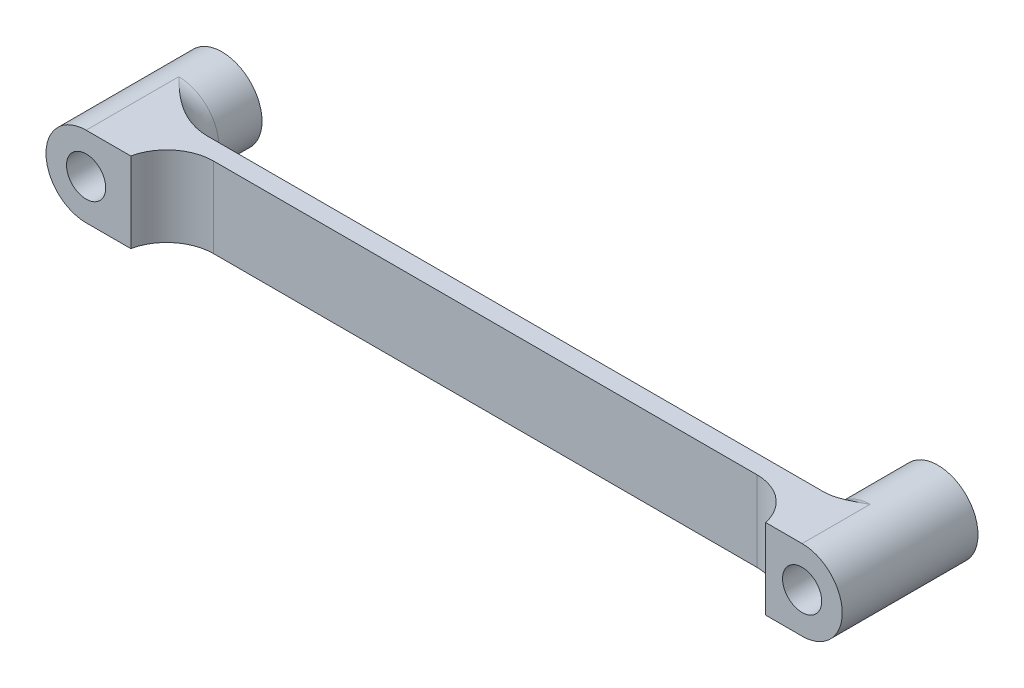
ISO-10303-21;
HEADER;
FILE_DESCRIPTION(('STEP AP214'),'2;1');
FILE_NAME('part.step','',(''),(''),'','','');
FILE_SCHEMA(('AUTOMOTIVE_DESIGN { 1 0 10303 214 1 1 1 1 }'));
ENDSEC;
DATA;
#1=APPLICATION_CONTEXT('core data for automotive mechanical design processes');
#2=APPLICATION_PROTOCOL_DEFINITION('international standard','automotive_design',2000,#1);
#3=PRODUCT_CONTEXT('',#1,'mechanical');
#4=PRODUCT('Part','Part','',(#3));
#5=PRODUCT_RELATED_PRODUCT_CATEGORY('part','',(#4));
#6=PRODUCT_DEFINITION_FORMATION('','',#4);
#7=PRODUCT_DEFINITION_CONTEXT('part definition',#1,'design');
#8=PRODUCT_DEFINITION('design','',#6,#7);
#9=PRODUCT_DEFINITION_SHAPE('','',#8);
#10=(LENGTH_UNIT() NAMED_UNIT(*) SI_UNIT(.MILLI.,.METRE.));
#11=(NAMED_UNIT(*) PLANE_ANGLE_UNIT() SI_UNIT($,.RADIAN.));
#12=(NAMED_UNIT(*) SI_UNIT($,.STERADIAN.) SOLID_ANGLE_UNIT());
#13=UNCERTAINTY_MEASURE_WITH_UNIT(LENGTH_MEASURE(1.E-05),#10,'distance_accuracy_value','');
#14=(GEOMETRIC_REPRESENTATION_CONTEXT(3) GLOBAL_UNCERTAINTY_ASSIGNED_CONTEXT((#13)) GLOBAL_UNIT_ASSIGNED_CONTEXT((#10,
#11,#12)) REPRESENTATION_CONTEXT('',''));
#15=CARTESIAN_POINT('',(0.,0.,0.));
#16=DIRECTION('',(0.,0.,1.));
#17=DIRECTION('',(1.,0.,0.));
#18=AXIS2_PLACEMENT_3D('',#15,#16,#17);
#19=CARTESIAN_POINT('',(19.,-24.5,11.));
#20=DIRECTION('',(0.,0.,1.));
#21=DIRECTION('',(1.,0.,0.));
#22=AXIS2_PLACEMENT_3D('',#19,#20,#21);
#23=PLANE('',#22);
#24=DIRECTION('',(0.,-1.,0.));
#25=VECTOR('',#24,1.);
#26=CARTESIAN_POINT('',(-35.3845066042764,-21.25,11.));
#27=LINE('',#26,#25);
#28=CARTESIAN_POINT('',(-35.3845066042764,-21.25,11.));
#29=VERTEX_POINT('',#28);
#30=CARTESIAN_POINT('',(-35.3845066042764,-27.75,11.));
#31=VERTEX_POINT('',#30);
#32=EDGE_CURVE('E143',#29,#31,#27,.T.);
#33=ORIENTED_EDGE('',*,*,#32,.F.);
#34=DIRECTION('',(-1.,0.,0.));
#35=VECTOR('',#34,1.);
#36=CARTESIAN_POINT('',(19.,-21.25,11.));
#37=LINE('',#36,#35);
#38=CARTESIAN_POINT('',(-39.,-21.25,11.));
#39=VERTEX_POINT('',#38);
#40=EDGE_CURVE('E132',#29,#39,#37,.T.);
#41=ORIENTED_EDGE('',*,*,#40,.T.);
#42=CARTESIAN_POINT('',(-39.,-24.5,11.));
#43=DIRECTION('',(0.,0.,1.));
#44=DIRECTION('',(1.,0.,0.));
#45=AXIS2_PLACEMENT_3D('',#42,#43,#44);
#46=CIRCLE('',#45,3.25);
#47=CARTESIAN_POINT('',(-39.,-27.75,11.));
#48=VERTEX_POINT('',#47);
#49=EDGE_CURVE('E165',#39,#48,#46,.T.);
#50=ORIENTED_EDGE('',*,*,#49,.T.);
#51=DIRECTION('',(1.,0.,0.));
#52=VECTOR('',#51,1.);
#53=CARTESIAN_POINT('',(19.,-27.75,11.));
#54=LINE('',#53,#52);
#55=EDGE_CURVE('E168',#48,#31,#54,.T.);
#56=ORIENTED_EDGE('',*,*,#55,.T.);
#57=EDGE_LOOP('',(#33,#41,#50,#56));
#58=FACE_BOUND('',#57,.T.);
#59=CARTESIAN_POINT('',(-39.,-24.5,11.));
#60=DIRECTION('',(0.,0.,1.));
#61=DIRECTION('',(1.,0.,0.));
#62=AXIS2_PLACEMENT_3D('',#59,#60,#61);
#63=CIRCLE('',#62,1.5875);
#64=CARTESIAN_POINT('',(-37.4125,-24.5,11.));
#65=VERTEX_POINT('',#64);
#66=EDGE_CURVE('E154',#65,#65,#63,.T.);
#67=ORIENTED_EDGE('',*,*,#66,.F.);
#68=EDGE_LOOP('',(#67));
#69=FACE_BOUND('',#68,.T.);
#70=ADVANCED_FACE('F35',(#58,#69),#23,.T.);
#71=CARTESIAN_POINT('',(19.,-24.5,6.5));
#72=DIRECTION('',(0.,0.,1.));
#73=DIRECTION('',(1.,0.,0.));
#74=AXIS2_PLACEMENT_3D('',#71,#72,#73);
#75=PLANE('',#74);
#76=DIRECTION('',(-1.,0.,0.));
#77=VECTOR('',#76,1.);
#78=CARTESIAN_POINT('',(19.,-21.25,6.5));
#79=LINE('',#78,#77);
#80=CARTESIAN_POINT('',(16.2613872124742,-21.25,6.5));
#81=VERTEX_POINT('',#80);
#82=CARTESIAN_POINT('',(-33.6614608739844,-21.25,6.5));
#83=VERTEX_POINT('',#82);
#84=EDGE_CURVE('E157',#81,#83,#79,.T.);
#85=ORIENTED_EDGE('',*,*,#84,.F.);
#86=CARTESIAN_POINT('',(19.,-24.5,6.5));
#87=DIRECTION('',(0.,0.,1.));
#88=DIRECTION('',(1.,0.,0.));
#89=AXIS2_PLACEMENT_3D('',#86,#87,#88);
#90=CIRCLE('',#89,4.25);
#91=CARTESIAN_POINT('',(16.2613872124742,-27.75,6.5));
#92=VERTEX_POINT('',#91);
#93=EDGE_CURVE('E274',#81,#92,#90,.T.);
#94=ORIENTED_EDGE('',*,*,#93,.T.);
#95=DIRECTION('',(1.,0.,0.));
#96=VECTOR('',#95,1.);
#97=CARTESIAN_POINT('',(19.,-27.75,6.5));
#98=LINE('',#97,#96);
#99=CARTESIAN_POINT('',(-33.6614608739844,-27.75,6.5));
#100=VERTEX_POINT('',#99);
#101=EDGE_CURVE('E161',#100,#92,#98,.T.);
#102=ORIENTED_EDGE('',*,*,#101,.F.);
#103=CARTESIAN_POINT('',(-39.,-24.5,6.5));
#104=DIRECTION('',(0.,0.,1.));
#105=DIRECTION('',(1.,0.,0.));
#106=AXIS2_PLACEMENT_3D('',#103,#104,#105);
#107=CIRCLE('',#106,6.25);
#108=EDGE_CURVE('E187',#100,#83,#107,.T.);
#109=ORIENTED_EDGE('',*,*,#108,.T.);
#110=EDGE_LOOP('',(#85,#94,#102,#109));
#111=FACE_BOUND('',#110,.T.);
#112=ADVANCED_FACE('F224',(#111),#75,.F.);
#113=CARTESIAN_POINT('',(19.,-24.5,0.));
#114=DIRECTION('',(0.,0.,1.));
#115=DIRECTION('',(1.,0.,0.));
#116=AXIS2_PLACEMENT_3D('',#113,#114,#115);
#117=PLANE('',#116);
#118=CARTESIAN_POINT('',(19.,-24.5,0.));
#119=DIRECTION('',(0.,0.,1.));
#120=DIRECTION('',(1.,0.,0.));
#121=AXIS2_PLACEMENT_3D('',#118,#119,#120);
#122=CIRCLE('',#121,3.25);
#123=CARTESIAN_POINT('',(22.25,-24.5,0.));
#124=VERTEX_POINT('',#123);
#125=EDGE_CURVE('E184',#124,#124,#122,.T.);
#126=ORIENTED_EDGE('',*,*,#125,.F.);
#127=EDGE_LOOP('',(#126));
#128=FACE_BOUND('',#127,.T.);
#129=CARTESIAN_POINT('',(19.,-24.5,0.));
#130=DIRECTION('',(0.,0.,1.));
#131=DIRECTION('',(1.,0.,0.));
#132=AXIS2_PLACEMENT_3D('',#129,#130,#131);
#133=CIRCLE('',#132,1.5875);
#134=CARTESIAN_POINT('',(17.4125,-24.5,0.));
#135=VERTEX_POINT('',#134);
#136=EDGE_CURVE('E181',#135,#135,#133,.T.);
#137=ORIENTED_EDGE('',*,*,#136,.T.);
#138=EDGE_LOOP('',(#137));
#139=FACE_BOUND('',#138,.T.);
#140=ADVANCED_FACE('F222',(#128,#139),#117,.F.);
#141=CARTESIAN_POINT('',(19.,-24.5,6.5));
#142=DIRECTION('',(0.,0.,-1.));
#143=DIRECTION('',(-1.,0.,0.));
#144=AXIS2_PLACEMENT_3D('',#141,#142,#143);
#145=CYLINDRICAL_SURFACE('',#144,3.25);
#146=DIRECTION('',(0.,0.,-1.));
#147=VECTOR('',#146,1.);
#148=CARTESIAN_POINT('',(19.,-27.75,11.));
#149=LINE('',#148,#147);
#150=CARTESIAN_POINT('',(19.,-27.75,11.));
#151=VERTEX_POINT('',#150);
#152=CARTESIAN_POINT('',(19.,-27.75,5.5));
#153=VERTEX_POINT('',#152);
#154=EDGE_CURVE('E59',#151,#153,#149,.T.);
#155=ORIENTED_EDGE('',*,*,#154,.T.);
#156=CARTESIAN_POINT('',(19.,-24.5,5.5));
#157=DIRECTION('',(0.,0.,1.));
#158=DIRECTION('',(1.,0.,0.));
#159=AXIS2_PLACEMENT_3D('',#156,#157,#158);
#160=CIRCLE('',#159,3.25);
#161=CARTESIAN_POINT('',(19.,-21.25,5.5));
#162=VERTEX_POINT('',#161);
#163=EDGE_CURVE('E260',#153,#162,#160,.F.);
#164=ORIENTED_EDGE('',*,*,#163,.T.);
#165=DIRECTION('',(0.,0.,-1.));
#166=VECTOR('',#165,1.);
#167=CARTESIAN_POINT('',(19.,-21.25,11.));
#168=LINE('',#167,#166);
#169=CARTESIAN_POINT('',(19.,-21.25,11.));
#170=VERTEX_POINT('',#169);
#171=EDGE_CURVE('E179',#170,#162,#168,.T.);
#172=ORIENTED_EDGE('',*,*,#171,.F.);
#173=CARTESIAN_POINT('',(19.,-24.5,11.));
#174=DIRECTION('',(0.,0.,1.));
#175=DIRECTION('',(1.,0.,0.));
#176=AXIS2_PLACEMENT_3D('',#173,#174,#175);
#177=CIRCLE('',#176,3.25);
#178=EDGE_CURVE('E158',#151,#170,#177,.T.);
#179=ORIENTED_EDGE('',*,*,#178,.F.);
#180=EDGE_LOOP('',(#155,#164,#172,#179));
#181=FACE_BOUND('',#180,.T.);
#182=ORIENTED_EDGE('',*,*,#125,.T.);
#183=EDGE_LOOP('',(#182));
#184=FACE_BOUND('',#183,.T.);
#185=ADVANCED_FACE('F217',(#181,#184),#145,.T.);
#186=CARTESIAN_POINT('',(19.,-24.5,6.5));
#187=DIRECTION('',(0.,0.,-1.));
#188=DIRECTION('',(-1.,0.,0.));
#189=AXIS2_PLACEMENT_3D('',#186,#187,#188);
#190=CYLINDRICAL_SURFACE('',#189,1.5875);
#191=CARTESIAN_POINT('',(19.,-24.5,11.));
#192=DIRECTION('',(0.,0.,1.));
#193=DIRECTION('',(1.,0.,0.));
#194=AXIS2_PLACEMENT_3D('',#191,#192,#193);
#195=CIRCLE('',#194,1.5875);
#196=CARTESIAN_POINT('',(17.4125,-24.5,11.));
#197=VERTEX_POINT('',#196);
#198=EDGE_CURVE('E151',#197,#197,#195,.T.);
#199=CARTESIAN_POINT('',(17.4125,-24.5,0.));
#200=CARTESIAN_POINT('',(17.4125,-24.5,0.114583333333334));
#201=CARTESIAN_POINT('',(17.4125,-24.5,0.229166666666667));
#202=CARTESIAN_POINT('',(17.4125,-24.5,0.458333333333333));
#203=CARTESIAN_POINT('',(17.4125,-24.5,0.572916666666667));
#204=CARTESIAN_POINT('',(17.4125,-24.5,0.802083333333333));
#205=CARTESIAN_POINT('',(17.4125,-24.5,0.916666666666667));
#206=CARTESIAN_POINT('',(17.4125,-24.5,1.14583333333333));
#207=CARTESIAN_POINT('',(17.4125,-24.5,1.26041666666667));
#208=CARTESIAN_POINT('',(17.4125,-24.5,1.48958333333333));
#209=CARTESIAN_POINT('',(17.4125,-24.5,1.60416666666667));
#210=CARTESIAN_POINT('',(17.4125,-24.5,1.83333333333333));
#211=CARTESIAN_POINT('',(17.4125,-24.5,1.94791666666667));
#212=CARTESIAN_POINT('',(17.4125,-24.5,2.17708333333333));
#213=CARTESIAN_POINT('',(17.4125,-24.5,2.29166666666667));
#214=CARTESIAN_POINT('',(17.4125,-24.5,2.52083333333333));
#215=CARTESIAN_POINT('',(17.4125,-24.5,2.63541666666667));
#216=CARTESIAN_POINT('',(17.4125,-24.5,2.86458333333333));
#217=CARTESIAN_POINT('',(17.4125,-24.5,2.97916666666667));
#218=CARTESIAN_POINT('',(17.4125,-24.5,3.20833333333333));
#219=CARTESIAN_POINT('',(17.4125,-24.5,3.32291666666667));
#220=CARTESIAN_POINT('',(17.4125,-24.5,3.55208333333333));
#221=CARTESIAN_POINT('',(17.4125,-24.5,3.66666666666667));
#222=CARTESIAN_POINT('',(17.4125,-24.5,3.89583333333333));
#223=CARTESIAN_POINT('',(17.4125,-24.5,4.01041666666667));
#224=CARTESIAN_POINT('',(17.4125,-24.5,4.23958333333333));
#225=CARTESIAN_POINT('',(17.4125,-24.5,4.35416666666667));
#226=CARTESIAN_POINT('',(17.4125,-24.5,4.58333333333333));
#227=CARTESIAN_POINT('',(17.4125,-24.5,4.69791666666667));
#228=CARTESIAN_POINT('',(17.4125,-24.5,4.92708333333333));
#229=CARTESIAN_POINT('',(17.4125,-24.5,5.04166666666667));
#230=CARTESIAN_POINT('',(17.4125,-24.5,5.27083333333333));
#231=CARTESIAN_POINT('',(17.4125,-24.5,5.38541666666667));
#232=CARTESIAN_POINT('',(17.4125,-24.5,5.61458333333333));
#233=CARTESIAN_POINT('',(17.4125,-24.5,5.72916666666667));
#234=CARTESIAN_POINT('',(17.4125,-24.5,5.95833333333333));
#235=CARTESIAN_POINT('',(17.4125,-24.5,6.07291666666667));
#236=CARTESIAN_POINT('',(17.4125,-24.5,6.30208333333333));
#237=CARTESIAN_POINT('',(17.4125,-24.5,6.41666666666667));
#238=CARTESIAN_POINT('',(17.4125,-24.5,6.64583333333333));
#239=CARTESIAN_POINT('',(17.4125,-24.5,6.76041666666667));
#240=CARTESIAN_POINT('',(17.4125,-24.5,6.98958333333333));
#241=CARTESIAN_POINT('',(17.4125,-24.5,7.10416666666667));
#242=CARTESIAN_POINT('',(17.4125,-24.5,7.33333333333333));
#243=CARTESIAN_POINT('',(17.4125,-24.5,7.44791666666667));
#244=CARTESIAN_POINT('',(17.4125,-24.5,7.67708333333333));
#245=CARTESIAN_POINT('',(17.4125,-24.5,7.79166666666667));
#246=CARTESIAN_POINT('',(17.4125,-24.5,8.02083333333333));
#247=CARTESIAN_POINT('',(17.4125,-24.5,8.13541666666667));
#248=CARTESIAN_POINT('',(17.4125,-24.5,8.36458333333333));
#249=CARTESIAN_POINT('',(17.4125,-24.5,8.47916666666666));
#250=CARTESIAN_POINT('',(17.4125,-24.5,8.70833333333333));
#251=CARTESIAN_POINT('',(17.4125,-24.5,8.82291666666666));
#252=CARTESIAN_POINT('',(17.4125,-24.5,9.05208333333333));
#253=CARTESIAN_POINT('',(17.4125,-24.5,9.16666666666666));
#254=CARTESIAN_POINT('',(17.4125,-24.5,9.39583333333333));
#255=CARTESIAN_POINT('',(17.4125,-24.5,9.51041666666667));
#256=CARTESIAN_POINT('',(17.4125,-24.5,9.73958333333333));
#257=CARTESIAN_POINT('',(17.4125,-24.5,9.85416666666667));
#258=CARTESIAN_POINT('',(17.4125,-24.5,10.0833333333333));
#259=CARTESIAN_POINT('',(17.4125,-24.5,10.1979166666667));
#260=CARTESIAN_POINT('',(17.4125,-24.5,10.4270833333333));
#261=CARTESIAN_POINT('',(17.4125,-24.5,10.5416666666667));
#262=CARTESIAN_POINT('',(17.4125,-24.5,10.7708333333333));
#263=CARTESIAN_POINT('',(17.4125,-24.5,10.8854166666667));
#264=CARTESIAN_POINT('',(17.4125,-24.5,11.));
#265=B_SPLINE_CURVE_WITH_KNOTS('',3,(#199,#200,#201,#202,#203,#204,#205,#206,#207,#208,#209,
#210,#211,#212,#213,#214,#215,#216,#217,#218,#219,#220,#221,#222,#223,#224,#225,#226,#227,#228,
#229,#230,#231,#232,#233,#234,#235,#236,#237,#238,#239,#240,#241,#242,#243,#244,#245,#246,#247,
#248,#249,#250,#251,#252,#253,#254,#255,#256,#257,#258,#259,#260,#261,#262,#263,#264),
.UNSPECIFIED.,.F.,.F.,(4,2,2,2,2,2,2,2,2,2,2,2,2,2,2,2,2,2,2,2,2,2,2,2,2,2,2,2,2,2,2,2,4),(0.,
0.34375,0.6875,1.03125,1.375,1.71875,2.0625,2.40625,2.75,3.09375,3.4375,3.78125,4.125,4.46875,
4.8125,5.15625,5.5,5.84375,6.1875,6.53125,6.875,7.21875,7.5625,7.90625,8.25,8.59375,8.9375,
9.28125,9.625,9.96875,10.3125,10.65625,11.),.UNSPECIFIED.);
#266=EDGE_CURVE('BSEAM221',#135,#197,#265,.T.);
#267=ORIENTED_EDGE('',*,*,#136,.F.);
#268=ORIENTED_EDGE('',*,*,#198,.T.);
#269=ORIENTED_EDGE('',*,*,#266,.T.);
#270=ORIENTED_EDGE('',*,*,#266,.F.);
#271=EDGE_LOOP('',(#267,#269,#268,#270));
#272=FACE_BOUND('',#271,.T.);
#273=ADVANCED_FACE('F221',(#272),#190,.F.);
#274=DIRECTION('',(0.,-1.,0.));
#275=VECTOR('',#274,1.);
#276=CARTESIAN_POINT('',(16.0451636441263,-21.25,11.));
#277=LINE('',#276,#275);
#278=CARTESIAN_POINT('',(16.0451636441263,-27.75,11.));
#279=VERTEX_POINT('',#278);
#280=CARTESIAN_POINT('',(16.0451636441263,-21.25,11.));
#281=VERTEX_POINT('',#280);
#282=EDGE_CURVE('E140',#279,#281,#277,.F.);
#283=ORIENTED_EDGE('',*,*,#282,.F.);
#284=EDGE_CURVE('E167',#279,#151,#54,.T.);
#285=ORIENTED_EDGE('',*,*,#284,.T.);
#286=ORIENTED_EDGE('',*,*,#178,.T.);
#287=EDGE_CURVE('E162',#170,#281,#37,.T.);
#288=ORIENTED_EDGE('',*,*,#287,.T.);
#289=EDGE_LOOP('',(#283,#285,#286,#288));
#290=FACE_BOUND('',#289,.T.);
#291=ORIENTED_EDGE('',*,*,#198,.F.);
#292=EDGE_LOOP('',(#291));
#293=FACE_BOUND('',#292,.T.);
#294=ADVANCED_FACE('F227',(#290,#293),#23,.T.);
#295=CARTESIAN_POINT('',(19.,-21.25,11.));
#296=DIRECTION('',(0.,-1.,0.));
#297=DIRECTION('',(1.,0.,0.));
#298=AXIS2_PLACEMENT_3D('',#295,#296,#297);
#299=PLANE('',#298);
#300=ORIENTED_EDGE('',*,*,#40,.F.);
#301=CARTESIAN_POINT('',(-31.669671480075,-21.25,11.8));
#302=DIRECTION('',(0.,-1.,0.));
#303=DIRECTION('',(1.,0.,0.));
#304=AXIS2_PLACEMENT_3D('',#301,#302,#303);
#305=CIRCLE('',#304,3.8);
#306=CARTESIAN_POINT('',(-31.669671480075,-21.25,8.));
#307=VERTEX_POINT('',#306);
#308=EDGE_CURVE('E116',#29,#307,#305,.T.);
#309=ORIENTED_EDGE('',*,*,#308,.T.);
#310=DIRECTION('',(1.,0.,0.));
#311=VECTOR('',#310,1.);
#312=CARTESIAN_POINT('',(-31.669671480075,-21.25,8.));
#313=LINE('',#312,#311);
#314=CARTESIAN_POINT('',(12.330328519925,-21.25,7.99999999999992));
#315=VERTEX_POINT('',#314);
#316=EDGE_CURVE('E123',#307,#315,#313,.T.);
#317=ORIENTED_EDGE('',*,*,#316,.T.);
#318=CARTESIAN_POINT('',(12.330328519925,-21.25,11.7999999999999));
#319=DIRECTION('',(0.,-1.,0.));
#320=DIRECTION('',(1.,0.,0.));
#321=AXIS2_PLACEMENT_3D('',#318,#319,#320);
#322=CIRCLE('',#321,3.8);
#323=EDGE_CURVE('E120',#315,#281,#322,.T.);
#324=ORIENTED_EDGE('',*,*,#323,.T.);
#325=ORIENTED_EDGE('',*,*,#287,.F.);
#326=ORIENTED_EDGE('',*,*,#171,.T.);
#327=CARTESIAN_POINT('',(16.2613872124742,-21.25,6.5));
#328=CARTESIAN_POINT('',(16.3409657362079,-21.25,6.49997627359847));
#329=CARTESIAN_POINT('',(16.420433758764,-21.25,6.49606090031815));
#330=CARTESIAN_POINT('',(16.5785908335455,-21.25,6.4814934510689));
#331=CARTESIAN_POINT('',(16.6572811982455,-21.25,6.47085595495058));
#332=CARTESIAN_POINT('',(16.8897117358366,-21.25,6.43076664688584));
#333=CARTESIAN_POINT('',(17.0420217368448,-21.25,6.39307825196676));
#334=CARTESIAN_POINT('',(17.3498669935084,-21.25,6.29933096971641));
#335=CARTESIAN_POINT('',(17.5051118936513,-21.25,6.24236839795998));
#336=CARTESIAN_POINT('',(17.8106846312229,-21.25,6.11638563736192));
#337=CARTESIAN_POINT('',(17.9610075374492,-21.25,6.04735377055791));
#338=CARTESIAN_POINT('',(18.4081235491878,-21.25,5.8282473092054));
#339=CARTESIAN_POINT('',(18.6991996229721,-21.2499999999999,5.66685328362163));
#340=CARTESIAN_POINT('',(18.9933529907817,-21.25,5.50368707785812));
#341=CARTESIAN_POINT('',(18.9966765059886,-21.25,5.50184352299673));
#342=CARTESIAN_POINT('',(19.,-21.25,5.5));
#343=B_SPLINE_CURVE_WITH_KNOTS('',3,(#327,#328,#329,#330,#331,#332,#333,#334,#335,#336,#337,
#338,#339,#340,#341,#342),.UNSPECIFIED.,.F.,.F.,(4,2,2,2,2,2,2,4),(0.,0.238475236364926,
0.476435002333868,0.945792964274522,1.44120729962607,1.93710366603863,2.93482380543762,
2.94622555968867),.UNSPECIFIED.);
#344=EDGE_CURVE('E44',#162,#81,#343,.F.);
#345=ORIENTED_EDGE('',*,*,#344,.T.);
#346=ORIENTED_EDGE('',*,*,#84,.T.);
#347=CARTESIAN_POINT('',(-33.6614608739844,-21.25,6.5));
#348=CARTESIAN_POINT('',(-33.7898032565093,-21.25,6.50001480648511));
#349=CARTESIAN_POINT('',(-33.9180726068381,-21.25,6.49399367521956));
#350=CARTESIAN_POINT('',(-34.1734097867455,-21.25,6.47072268647788));
#351=CARTESIAN_POINT('',(-34.300479103099,-21.25,6.45348931710398));
#352=CARTESIAN_POINT('',(-34.5512781920352,-21.25,6.40889255229715));
#353=CARTESIAN_POINT('',(-34.6750296084118,-21.25,6.38164907939267));
#354=CARTESIAN_POINT('',(-34.9201505172762,-21.25,6.31786323934337));
#355=CARTESIAN_POINT('',(-35.0415188495533,-21.25,6.28131645812283));
#356=CARTESIAN_POINT('',(-35.3332747967713,-21.25,6.18215800616293));
#357=CARTESIAN_POINT('',(-35.502161958763,-21.25,6.11510943454703));
#358=CARTESIAN_POINT('',(-35.8332767043792,-21.25,5.96628490335657));
#359=CARTESIAN_POINT('',(-35.9955019064686,-21.25,5.88450373245225));
#360=CARTESIAN_POINT('',(-36.4734261080613,-21.25,5.61986918676728));
#361=CARTESIAN_POINT('',(-36.7787725519498,-21.25,5.41831192072351));
#362=CARTESIAN_POINT('',(-37.4153000384415,-21.25,4.94658002379956));
#363=CARTESIAN_POINT('',(-37.7419576519292,-21.25,4.67056561479315));
#364=CARTESIAN_POINT('',(-38.3763609460884,-21.25,4.09900662027665));
#365=CARTESIAN_POINT('',(-38.6841249061783,-21.2499999999999,3.80348150473128));
#366=CARTESIAN_POINT('',(-38.9945187209696,-21.25,3.50526624235523));
#367=CARTESIAN_POINT('',(-38.9972593616394,-21.25,3.50263311996617));
#368=CARTESIAN_POINT('',(-39.,-21.25,3.5));
#369=B_SPLINE_CURVE_WITH_KNOTS('',3,(#347,#348,#349,#350,#351,#352,#353,#354,#355,#356,#357,
#358,#359,#360,#361,#362,#363,#364,#365,#366,#367,#368),.UNSPECIFIED.,.F.,.F.,(4,2,2,2,2,2,2,2,
2,2,4),(0.,0.384779087963394,0.768993615951416,1.14874777799935,1.52868245627884,
2.07292929376279,2.61736902584813,3.71130250993715,4.99247263839822,6.27238305165132,
6.28378480590232),.UNSPECIFIED.);
#370=CARTESIAN_POINT('',(-39.,-21.25,3.5));
#371=VERTEX_POINT('',#370);
#372=EDGE_CURVE('E193',#83,#371,#369,.T.);
#373=ORIENTED_EDGE('',*,*,#372,.T.);
#374=DIRECTION('',(0.,0.,-1.));
#375=VECTOR('',#374,1.);
#376=CARTESIAN_POINT('',(-39.,-21.25,11.));
#377=LINE('',#376,#375);
#378=EDGE_CURVE('E177',#39,#371,#377,.T.);
#379=ORIENTED_EDGE('',*,*,#378,.F.);
#380=EDGE_LOOP('',(#300,#309,#317,#324,#325,#326,#345,#346,#373,#379));
#381=FACE_BOUND('',#380,.T.);
#382=ADVANCED_FACE('F130',(#381),#299,.F.);
#383=CARTESIAN_POINT('',(-39.,-24.5,11.));
#384=DIRECTION('',(0.,0.,-1.));
#385=DIRECTION('',(-1.,0.,0.));
#386=AXIS2_PLACEMENT_3D('',#383,#384,#385);
#387=CYLINDRICAL_SURFACE('',#386,3.25);
#388=ORIENTED_EDGE('',*,*,#378,.T.);
#389=CARTESIAN_POINT('',(-39.,-24.5,3.5));
#390=DIRECTION('',(0.,0.,1.));
#391=DIRECTION('',(1.,0.,0.));
#392=AXIS2_PLACEMENT_3D('',#389,#390,#391);
#393=CIRCLE('',#392,3.25);
#394=CARTESIAN_POINT('',(-39.,-27.75,3.5));
#395=VERTEX_POINT('',#394);
#396=EDGE_CURVE('E190',#371,#395,#393,.F.);
#397=ORIENTED_EDGE('',*,*,#396,.T.);
#398=DIRECTION('',(0.,0.,-1.));
#399=VECTOR('',#398,1.);
#400=CARTESIAN_POINT('',(-39.,-27.75,11.));
#401=LINE('',#400,#399);
#402=EDGE_CURVE('E175',#48,#395,#401,.T.);
#403=ORIENTED_EDGE('',*,*,#402,.F.);
#404=ORIENTED_EDGE('',*,*,#49,.F.);
#405=EDGE_LOOP('',(#388,#397,#403,#404));
#406=FACE_BOUND('',#405,.T.);
#407=CARTESIAN_POINT('',(-39.,-24.5,0.));
#408=DIRECTION('',(0.,0.,1.));
#409=DIRECTION('',(1.,0.,0.));
#410=AXIS2_PLACEMENT_3D('',#407,#408,#409);
#411=CIRCLE('',#410,3.25);
#412=CARTESIAN_POINT('',(-35.75,-24.5,0.));
#413=VERTEX_POINT('',#412);
#414=EDGE_CURVE('E148',#413,#413,#411,.T.);
#415=ORIENTED_EDGE('',*,*,#414,.T.);
#416=EDGE_LOOP('',(#415));
#417=FACE_BOUND('',#416,.T.);
#418=ADVANCED_FACE('F250',(#406,#417),#387,.T.);
#419=CARTESIAN_POINT('',(19.,-27.75,11.));
#420=DIRECTION('',(0.,1.,0.));
#421=DIRECTION('',(-1.,0.,0.));
#422=AXIS2_PLACEMENT_3D('',#419,#420,#421);
#423=PLANE('',#422);
#424=DIRECTION('',(1.,0.,0.));
#425=VECTOR('',#424,1.);
#426=CARTESIAN_POINT('',(-31.669671480075,-27.75,8.));
#427=LINE('',#426,#425);
#428=CARTESIAN_POINT('',(-31.669671480075,-27.75,8.));
#429=VERTEX_POINT('',#428);
#430=CARTESIAN_POINT('',(12.330328519925,-27.75,7.99999999999992));
#431=VERTEX_POINT('',#430);
#432=EDGE_CURVE('E135',#429,#431,#427,.T.);
#433=ORIENTED_EDGE('',*,*,#432,.F.);
#434=CARTESIAN_POINT('',(-31.669671480075,-27.75,11.8));
#435=DIRECTION('',(0.,1.,0.));
#436=DIRECTION('',(-1.,0.,0.));
#437=AXIS2_PLACEMENT_3D('',#434,#435,#436);
#438=CIRCLE('',#437,3.8);
#439=EDGE_CURVE('E11',#429,#31,#438,.T.);
#440=ORIENTED_EDGE('',*,*,#439,.T.);
#441=ORIENTED_EDGE('',*,*,#55,.F.);
#442=ORIENTED_EDGE('',*,*,#402,.T.);
#443=CARTESIAN_POINT('',(-33.6614608739844,-27.75,6.5));
#444=CARTESIAN_POINT('',(-33.7898032565076,-27.75,6.50001480648511));
#445=CARTESIAN_POINT('',(-33.9180726068347,-27.75,6.49399367521972));
#446=CARTESIAN_POINT('',(-34.1734097867387,-27.75,6.47072268647866));
#447=CARTESIAN_POINT('',(-34.3004791030904,-27.75,6.45348931710521));
#448=CARTESIAN_POINT('',(-34.5512781920266,-27.75,6.40889255229895));
#449=CARTESIAN_POINT('',(-34.6750296084049,-27.75,6.3816490793943));
#450=CARTESIAN_POINT('',(-34.9201505172728,-27.75,6.31786323934439));
#451=CARTESIAN_POINT('',(-35.0415188495517,-27.75,6.28131645812342));
#452=CARTESIAN_POINT('',(-35.3332747967728,-27.75,6.18215800616239));
#453=CARTESIAN_POINT('',(-35.5021619587658,-27.75,6.11510943454573));
#454=CARTESIAN_POINT('',(-35.8332767043848,-27.75,5.96628490335411));
#455=CARTESIAN_POINT('',(-35.9955019064757,-27.75,5.88450373244941));
#456=CARTESIAN_POINT('',(-36.4734261080651,-27.75,5.619869186763));
#457=CARTESIAN_POINT('',(-36.7787725519465,-27.75,5.41831192071592));
#458=CARTESIAN_POINT('',(-37.4153000384469,-27.75,4.94658002380734));
#459=CARTESIAN_POINT('',(-37.741957651954,-27.75,4.67056561482346));
#460=CARTESIAN_POINT('',(-38.3763609460589,-27.75,4.09900662025046));
#461=CARTESIAN_POINT('',(-38.684124906075,-27.7499999999999,3.80348150462602));
#462=CARTESIAN_POINT('',(-38.9945187209678,-27.75,3.50526624235337));
#463=CARTESIAN_POINT('',(-38.9972593616385,-27.75,3.50263311996523));
#464=CARTESIAN_POINT('',(-39.,-27.75,3.5));
#465=B_SPLINE_CURVE_WITH_KNOTS('',3,(#443,#444,#445,#446,#447,#448,#449,#450,#451,#452,#453,
#454,#455,#456,#457,#458,#459,#460,#461,#462,#463,#464),.UNSPECIFIED.,.F.,.F.,(4,2,2,2,2,2,2,2,
2,2,4),(0.,0.384779087958299,0.768993615940995,1.14874777799402,1.52868245627884,
2.07292929376749,2.61736902585684,3.71130250993714,4.99247263839363,6.27238305165126,
6.2837848059023),.UNSPECIFIED.);
#466=EDGE_CURVE('E201',#395,#100,#465,.F.);
#467=ORIENTED_EDGE('',*,*,#466,.T.);
#468=ORIENTED_EDGE('',*,*,#101,.T.);
#469=CARTESIAN_POINT('',(16.2613872124742,-27.75,6.5));
#470=CARTESIAN_POINT('',(16.3409657362079,-27.75,6.49997627359847));
#471=CARTESIAN_POINT('',(16.420433758764,-27.75,6.49606090031815));
#472=CARTESIAN_POINT('',(16.5785908335455,-27.75,6.4814934510689));
#473=CARTESIAN_POINT('',(16.6572811982455,-27.75,6.47085595495058));
#474=CARTESIAN_POINT('',(16.8897117358366,-27.75,6.43076664688584));
#475=CARTESIAN_POINT('',(17.0420217368448,-27.75,6.39307825196676));
#476=CARTESIAN_POINT('',(17.3498669935084,-27.75,6.29933096971641));
#477=CARTESIAN_POINT('',(17.5051118936513,-27.75,6.24236839795998));
#478=CARTESIAN_POINT('',(17.8106846312229,-27.75,6.11638563736192));
#479=CARTESIAN_POINT('',(17.9610075374492,-27.75,6.04735377055791));
#480=CARTESIAN_POINT('',(18.4081235491878,-27.75,5.82824730920541));
#481=CARTESIAN_POINT('',(18.6991996229721,-27.7500000000001,5.66685328362165));
#482=CARTESIAN_POINT('',(18.9933529907817,-27.75,5.50368707785812));
#483=CARTESIAN_POINT('',(18.9966765059886,-27.75,5.50184352299673));
#484=CARTESIAN_POINT('',(19.,-27.75,5.5));
#485=B_SPLINE_CURVE_WITH_KNOTS('',3,(#469,#470,#471,#472,#473,#474,#475,#476,#477,#478,#479,
#480,#481,#482,#483,#484),.UNSPECIFIED.,.F.,.F.,(4,2,2,2,2,2,2,4),(0.,0.238475236364926,
0.476435002333865,0.945792964274522,1.44120729962607,1.93710366603862,2.93482380543762,
2.94622555968867),.UNSPECIFIED.);
#486=EDGE_CURVE('E254',#92,#153,#485,.T.);
#487=ORIENTED_EDGE('',*,*,#486,.T.);
#488=ORIENTED_EDGE('',*,*,#154,.F.);
#489=ORIENTED_EDGE('',*,*,#284,.F.);
#490=CARTESIAN_POINT('',(12.330328519925,-27.75,11.7999999999999));
#491=DIRECTION('',(0.,-1.,0.));
#492=DIRECTION('',(1.,0.,0.));
#493=AXIS2_PLACEMENT_3D('',#490,#491,#492);
#494=CIRCLE('',#493,3.8);
#495=EDGE_CURVE('E133',#431,#279,#494,.T.);
#496=ORIENTED_EDGE('',*,*,#495,.F.);
#497=EDGE_LOOP('',(#433,#440,#441,#442,#467,#468,#487,#488,#489,#496));
#498=FACE_BOUND('',#497,.T.);
#499=ADVANCED_FACE('F247',(#498),#423,.F.);
#500=CARTESIAN_POINT('',(-39.,-24.5,11.));
#501=DIRECTION('',(0.,0.,-1.));
#502=DIRECTION('',(-1.,0.,0.));
#503=AXIS2_PLACEMENT_3D('',#500,#501,#502);
#504=CYLINDRICAL_SURFACE('',#503,1.5875);
#505=ORIENTED_EDGE('',*,*,#66,.T.);
#506=EDGE_LOOP('',(#505));
#507=FACE_BOUND('',#506,.T.);
#508=CARTESIAN_POINT('',(-39.,-24.5,0.));
#509=DIRECTION('',(0.,0.,1.));
#510=DIRECTION('',(1.,0.,0.));
#511=AXIS2_PLACEMENT_3D('',#508,#509,#510);
#512=CIRCLE('',#511,1.5875);
#513=CARTESIAN_POINT('',(-37.4125,-24.5,0.));
#514=VERTEX_POINT('',#513);
#515=EDGE_CURVE('E145',#514,#514,#512,.T.);
#516=ORIENTED_EDGE('',*,*,#515,.F.);
#517=EDGE_LOOP('',(#516));
#518=FACE_BOUND('',#517,.T.);
#519=ADVANCED_FACE('F245',(#507,#518),#504,.F.);
#520=CARTESIAN_POINT('',(-39.,-24.5,0.));
#521=DIRECTION('',(0.,0.,1.));
#522=DIRECTION('',(1.,0.,0.));
#523=AXIS2_PLACEMENT_3D('',#520,#521,#522);
#524=PLANE('',#523);
#525=ORIENTED_EDGE('',*,*,#414,.F.);
#526=EDGE_LOOP('',(#525));
#527=FACE_BOUND('',#526,.T.);
#528=ORIENTED_EDGE('',*,*,#515,.T.);
#529=EDGE_LOOP('',(#528));
#530=FACE_BOUND('',#529,.T.);
#531=ADVANCED_FACE('F215',(#527,#530),#524,.F.);
#532=CARTESIAN_POINT('',(-39.,-24.5,3.5));
#533=DIRECTION('',(0.,0.,1.));
#534=DIRECTION('',(1.,0.,0.));
#535=AXIS2_PLACEMENT_3D('',#532,#533,#534);
#536=TOROIDAL_SURFACE('',#535,6.25,3.);
#537=ORIENTED_EDGE('',*,*,#466,.F.);
#538=ORIENTED_EDGE('',*,*,#396,.F.);
#539=ORIENTED_EDGE('',*,*,#372,.F.);
#540=ORIENTED_EDGE('',*,*,#108,.F.);
#541=EDGE_LOOP('',(#537,#538,#539,#540));
#542=FACE_BOUND('',#541,.T.);
#543=ADVANCED_FACE('F211',(#542),#536,.F.);
#544=CARTESIAN_POINT('',(19.,-24.5,5.5));
#545=DIRECTION('',(0.,0.,1.));
#546=DIRECTION('',(1.,0.,0.));
#547=AXIS2_PLACEMENT_3D('',#544,#545,#546);
#548=TOROIDAL_SURFACE('',#547,4.25,1.);
#549=ORIENTED_EDGE('',*,*,#344,.F.);
#550=ORIENTED_EDGE('',*,*,#163,.F.);
#551=ORIENTED_EDGE('',*,*,#486,.F.);
#552=ORIENTED_EDGE('',*,*,#93,.F.);
#553=EDGE_LOOP('',(#549,#550,#551,#552));
#554=FACE_BOUND('',#553,.T.);
#555=ADVANCED_FACE('F37',(#554),#548,.F.);
#556=CARTESIAN_POINT('',(-31.669671480075,-21.25,11.8));
#557=DIRECTION('',(0.,-1.,0.));
#558=DIRECTION('',(1.,0.,0.));
#559=AXIS2_PLACEMENT_3D('',#556,#557,#558);
#560=CYLINDRICAL_SURFACE('',#559,3.8);
#561=ORIENTED_EDGE('',*,*,#32,.T.);
#562=ORIENTED_EDGE('',*,*,#439,.F.);
#563=DIRECTION('',(0.,-1.,0.));
#564=VECTOR('',#563,1.);
#565=CARTESIAN_POINT('',(-31.669671480075,-21.25,8.));
#566=LINE('',#565,#564);
#567=EDGE_CURVE('E51',#307,#429,#566,.T.);
#568=ORIENTED_EDGE('',*,*,#567,.F.);
#569=ORIENTED_EDGE('',*,*,#308,.F.);
#570=EDGE_LOOP('',(#561,#562,#568,#569));
#571=FACE_BOUND('',#570,.T.);
#572=ADVANCED_FACE('F114',(#571),#560,.F.);
#573=CARTESIAN_POINT('',(12.330328519925,-21.25,11.7999999999999));
#574=DIRECTION('',(0.,-1.,0.));
#575=DIRECTION('',(1.,0.,0.));
#576=AXIS2_PLACEMENT_3D('',#573,#574,#575);
#577=CYLINDRICAL_SURFACE('',#576,3.8);
#578=ORIENTED_EDGE('',*,*,#282,.T.);
#579=ORIENTED_EDGE('',*,*,#323,.F.);
#580=DIRECTION('',(0.,-1.,0.));
#581=VECTOR('',#580,1.);
#582=CARTESIAN_POINT('',(12.330328519925,-21.25,7.99999999999992));
#583=LINE('',#582,#581);
#584=EDGE_CURVE('E119',#315,#431,#583,.T.);
#585=ORIENTED_EDGE('',*,*,#584,.T.);
#586=ORIENTED_EDGE('',*,*,#495,.T.);
#587=EDGE_LOOP('',(#578,#579,#585,#586));
#588=FACE_BOUND('',#587,.T.);
#589=ADVANCED_FACE('F287',(#588),#577,.F.);
#590=CARTESIAN_POINT('',(-31.669671480075,-21.25,8.));
#591=DIRECTION('',(0.,0.,-1.));
#592=DIRECTION('',(-1.,0.,0.));
#593=AXIS2_PLACEMENT_3D('',#590,#591,#592);
#594=PLANE('',#593);
#595=ORIENTED_EDGE('',*,*,#432,.T.);
#596=ORIENTED_EDGE('',*,*,#584,.F.);
#597=ORIENTED_EDGE('',*,*,#316,.F.);
#598=ORIENTED_EDGE('',*,*,#567,.T.);
#599=EDGE_LOOP('',(#595,#596,#597,#598));
#600=FACE_BOUND('',#599,.T.);
#601=ADVANCED_FACE('F124',(#600),#594,.F.);
#602=CLOSED_SHELL('',(#70,#112,#140,#185,#273,#294,#382,#418,#499,#519,#531,#543,#555,#572,#589,#601));
#603=MANIFOLD_SOLID_BREP('B2',#602);
#604=ADVANCED_BREP_SHAPE_REPRESENTATION('',(#18,#603),#14);
#605=SHAPE_DEFINITION_REPRESENTATION(#9,#604);
ENDSEC;
END-ISO-10303-21;
